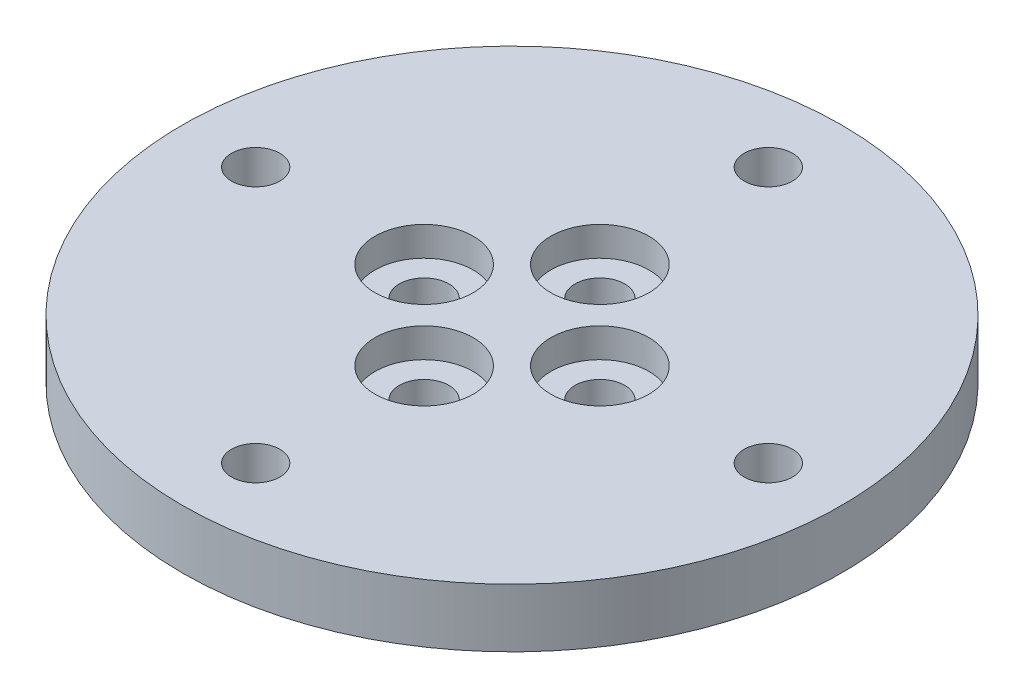
ISO-10303-21;
HEADER;
FILE_DESCRIPTION(('STEP AP214'),'2;1');
FILE_NAME('part.step','',(''),(''),'','','');
FILE_SCHEMA(('AUTOMOTIVE_DESIGN { 1 0 10303 214 1 1 1 1 }'));
ENDSEC;
DATA;
#1=APPLICATION_CONTEXT('core data for automotive mechanical design processes');
#2=APPLICATION_PROTOCOL_DEFINITION('international standard','automotive_design',2000,#1);
#3=PRODUCT_CONTEXT('',#1,'mechanical');
#4=PRODUCT('Part','Part','',(#3));
#5=PRODUCT_RELATED_PRODUCT_CATEGORY('part','',(#4));
#6=PRODUCT_DEFINITION_FORMATION('','',#4);
#7=PRODUCT_DEFINITION_CONTEXT('part definition',#1,'design');
#8=PRODUCT_DEFINITION('design','',#6,#7);
#9=PRODUCT_DEFINITION_SHAPE('','',#8);
#10=(LENGTH_UNIT() NAMED_UNIT(*) SI_UNIT(.MILLI.,.METRE.));
#11=(NAMED_UNIT(*) PLANE_ANGLE_UNIT() SI_UNIT($,.RADIAN.));
#12=(NAMED_UNIT(*) SI_UNIT($,.STERADIAN.) SOLID_ANGLE_UNIT());
#13=UNCERTAINTY_MEASURE_WITH_UNIT(LENGTH_MEASURE(1.E-05),#10,'distance_accuracy_value','');
#14=(GEOMETRIC_REPRESENTATION_CONTEXT(3) GLOBAL_UNCERTAINTY_ASSIGNED_CONTEXT((#13)) GLOBAL_UNIT_ASSIGNED_CONTEXT((#10,
#11,#12)) REPRESENTATION_CONTEXT('',''));
#15=CARTESIAN_POINT('',(0.,0.,0.));
#16=DIRECTION('',(0.,0.,1.));
#17=DIRECTION('',(1.,0.,0.));
#18=AXIS2_PLACEMENT_3D('',#15,#16,#17);
#19=CARTESIAN_POINT('',(0.,4.,0.));
#20=DIRECTION('',(0.,-1.,0.));
#21=DIRECTION('',(0.,0.,-1.));
#22=AXIS2_PLACEMENT_3D('',#19,#20,#21);
#23=CYLINDRICAL_SURFACE('',#22,22.5);
#24=CARTESIAN_POINT('',(0.,4.,0.));
#25=DIRECTION('',(0.,1.,0.));
#26=DIRECTION('',(0.,0.,1.));
#27=AXIS2_PLACEMENT_3D('',#24,#25,#26);
#28=CIRCLE('',#27,22.5);
#29=CARTESIAN_POINT('',(0.,4.,22.5));
#30=VERTEX_POINT('',#29);
#31=EDGE_CURVE('E10',#30,#30,#28,.T.);
#32=ORIENTED_EDGE('',*,*,#31,.F.);
#33=EDGE_LOOP('',(#32));
#34=FACE_BOUND('',#33,.T.);
#35=CARTESIAN_POINT('',(0.,0.,0.));
#36=DIRECTION('',(0.,1.,0.));
#37=DIRECTION('',(0.,0.,1.));
#38=AXIS2_PLACEMENT_3D('',#35,#36,#37);
#39=CIRCLE('',#38,22.5);
#40=CARTESIAN_POINT('',(0.,0.,22.5));
#41=VERTEX_POINT('',#40);
#42=EDGE_CURVE('E40',#41,#41,#39,.T.);
#43=ORIENTED_EDGE('',*,*,#42,.T.);
#44=EDGE_LOOP('',(#43));
#45=FACE_BOUND('',#44,.T.);
#46=ADVANCED_FACE('F37',(#34,#45),#23,.T.);
#47=CARTESIAN_POINT('',(0.,4.,0.));
#48=DIRECTION('',(0.,1.,0.));
#49=DIRECTION('',(0.,0.,1.));
#50=AXIS2_PLACEMENT_3D('',#47,#48,#49);
#51=PLANE('',#50);
#52=CARTESIAN_POINT('',(-17.5,4.,0.));
#53=DIRECTION('',(0.,1.,0.));
#54=DIRECTION('',(0.,0.,1.));
#55=AXIS2_PLACEMENT_3D('',#52,#53,#54);
#56=CIRCLE('',#55,1.64999999999999);
#57=CARTESIAN_POINT('',(-17.5,4.,1.64999999999999));
#58=VERTEX_POINT('',#57);
#59=EDGE_CURVE('E117',#58,#58,#56,.T.);
#60=ORIENTED_EDGE('',*,*,#59,.F.);
#61=EDGE_LOOP('',(#60));
#62=FACE_BOUND('',#61,.T.);
#63=CARTESIAN_POINT('',(0.,4.,17.5));
#64=DIRECTION('',(0.,1.,0.));
#65=DIRECTION('',(0.,0.,1.));
#66=AXIS2_PLACEMENT_3D('',#63,#64,#65);
#67=CIRCLE('',#66,1.64999999999999);
#68=CARTESIAN_POINT('',(0.,4.,19.15));
#69=VERTEX_POINT('',#68);
#70=EDGE_CURVE('E111',#69,#69,#67,.T.);
#71=ORIENTED_EDGE('',*,*,#70,.F.);
#72=EDGE_LOOP('',(#71));
#73=FACE_BOUND('',#72,.T.);
#74=CARTESIAN_POINT('',(17.5,4.,0.));
#75=DIRECTION('',(0.,1.,0.));
#76=DIRECTION('',(0.,0.,1.));
#77=AXIS2_PLACEMENT_3D('',#74,#75,#76);
#78=CIRCLE('',#77,1.64999999999999);
#79=CARTESIAN_POINT('',(17.5,4.,1.64999999999999));
#80=VERTEX_POINT('',#79);
#81=EDGE_CURVE('E105',#80,#80,#78,.T.);
#82=ORIENTED_EDGE('',*,*,#81,.F.);
#83=EDGE_LOOP('',(#82));
#84=FACE_BOUND('',#83,.T.);
#85=CARTESIAN_POINT('',(0.,4.,-17.5));
#86=DIRECTION('',(0.,1.,0.));
#87=DIRECTION('',(0.,0.,1.));
#88=AXIS2_PLACEMENT_3D('',#85,#86,#87);
#89=CIRCLE('',#88,1.64999999999999);
#90=CARTESIAN_POINT('',(0.,4.,-15.85));
#91=VERTEX_POINT('',#90);
#92=EDGE_CURVE('E99',#91,#91,#89,.T.);
#93=ORIENTED_EDGE('',*,*,#92,.F.);
#94=EDGE_LOOP('',(#93));
#95=FACE_BOUND('',#94,.T.);
#96=CARTESIAN_POINT('',(0.,4.,-6.));
#97=DIRECTION('',(0.,1.,0.));
#98=DIRECTION('',(0.,0.,1.));
#99=AXIS2_PLACEMENT_3D('',#96,#97,#98);
#100=CIRCLE('',#99,3.35);
#101=CARTESIAN_POINT('',(0.,4.,-2.65));
#102=VERTEX_POINT('',#101);
#103=EDGE_CURVE('E93',#102,#102,#100,.T.);
#104=ORIENTED_EDGE('',*,*,#103,.F.);
#105=EDGE_LOOP('',(#104));
#106=FACE_BOUND('',#105,.T.);
#107=CARTESIAN_POINT('',(-6.,4.,0.));
#108=DIRECTION('',(0.,1.,0.));
#109=DIRECTION('',(0.,0.,1.));
#110=AXIS2_PLACEMENT_3D('',#107,#108,#109);
#111=CIRCLE('',#110,3.35);
#112=CARTESIAN_POINT('',(-6.,4.,3.35));
#113=VERTEX_POINT('',#112);
#114=EDGE_CURVE('E81',#113,#113,#111,.T.);
#115=ORIENTED_EDGE('',*,*,#114,.F.);
#116=EDGE_LOOP('',(#115));
#117=FACE_BOUND('',#116,.T.);
#118=CARTESIAN_POINT('',(0.,4.,6.));
#119=DIRECTION('',(0.,1.,0.));
#120=DIRECTION('',(0.,0.,1.));
#121=AXIS2_PLACEMENT_3D('',#118,#119,#120);
#122=CIRCLE('',#121,3.35);
#123=CARTESIAN_POINT('',(0.,4.,9.35));
#124=VERTEX_POINT('',#123);
#125=EDGE_CURVE('E69',#124,#124,#122,.T.);
#126=ORIENTED_EDGE('',*,*,#125,.F.);
#127=EDGE_LOOP('',(#126));
#128=FACE_BOUND('',#127,.T.);
#129=CARTESIAN_POINT('',(6.,4.,0.));
#130=DIRECTION('',(0.,1.,0.));
#131=DIRECTION('',(0.,0.,1.));
#132=AXIS2_PLACEMENT_3D('',#129,#130,#131);
#133=CIRCLE('',#132,3.35);
#134=CARTESIAN_POINT('',(6.,4.,3.35));
#135=VERTEX_POINT('',#134);
#136=EDGE_CURVE('E57',#135,#135,#133,.T.);
#137=ORIENTED_EDGE('',*,*,#136,.F.);
#138=EDGE_LOOP('',(#137));
#139=FACE_BOUND('',#138,.T.);
#140=ORIENTED_EDGE('',*,*,#31,.T.);
#141=EDGE_LOOP('',(#140));
#142=FACE_BOUND('',#141,.T.);
#143=ADVANCED_FACE('F123',(#62,#73,#84,#95,#106,#117,#128,#139,#142),#51,.T.);
#144=CARTESIAN_POINT('',(0.,0.,0.));
#145=DIRECTION('',(0.,1.,0.));
#146=DIRECTION('',(0.,0.,1.));
#147=AXIS2_PLACEMENT_3D('',#144,#145,#146);
#148=PLANE('',#147);
#149=CARTESIAN_POINT('',(-17.5,0.,0.));
#150=DIRECTION('',(0.,1.,0.));
#151=DIRECTION('',(0.,0.,1.));
#152=AXIS2_PLACEMENT_3D('',#149,#150,#151);
#153=CIRCLE('',#152,1.64999999999999);
#154=CARTESIAN_POINT('',(-17.5,0.,1.64999999999999));
#155=VERTEX_POINT('',#154);
#156=EDGE_CURVE('E114',#155,#155,#153,.T.);
#157=ORIENTED_EDGE('',*,*,#156,.T.);
#158=EDGE_LOOP('',(#157));
#159=FACE_BOUND('',#158,.T.);
#160=CARTESIAN_POINT('',(0.,0.,17.5));
#161=DIRECTION('',(0.,1.,0.));
#162=DIRECTION('',(0.,0.,1.));
#163=AXIS2_PLACEMENT_3D('',#160,#161,#162);
#164=CIRCLE('',#163,1.64999999999999);
#165=CARTESIAN_POINT('',(0.,0.,19.15));
#166=VERTEX_POINT('',#165);
#167=EDGE_CURVE('E108',#166,#166,#164,.T.);
#168=ORIENTED_EDGE('',*,*,#167,.T.);
#169=EDGE_LOOP('',(#168));
#170=FACE_BOUND('',#169,.T.);
#171=CARTESIAN_POINT('',(17.5,0.,0.));
#172=DIRECTION('',(0.,1.,0.));
#173=DIRECTION('',(0.,0.,1.));
#174=AXIS2_PLACEMENT_3D('',#171,#172,#173);
#175=CIRCLE('',#174,1.64999999999999);
#176=CARTESIAN_POINT('',(17.5,0.,1.64999999999999));
#177=VERTEX_POINT('',#176);
#178=EDGE_CURVE('E102',#177,#177,#175,.T.);
#179=ORIENTED_EDGE('',*,*,#178,.T.);
#180=EDGE_LOOP('',(#179));
#181=FACE_BOUND('',#180,.T.);
#182=CARTESIAN_POINT('',(0.,0.,-17.5));
#183=DIRECTION('',(0.,1.,0.));
#184=DIRECTION('',(0.,0.,1.));
#185=AXIS2_PLACEMENT_3D('',#182,#183,#184);
#186=CIRCLE('',#185,1.64999999999999);
#187=CARTESIAN_POINT('',(0.,0.,-15.85));
#188=VERTEX_POINT('',#187);
#189=EDGE_CURVE('E96',#188,#188,#186,.T.);
#190=ORIENTED_EDGE('',*,*,#189,.T.);
#191=EDGE_LOOP('',(#190));
#192=FACE_BOUND('',#191,.T.);
#193=CARTESIAN_POINT('',(0.,0.,-6.));
#194=DIRECTION('',(0.,1.,0.));
#195=DIRECTION('',(0.,0.,1.));
#196=AXIS2_PLACEMENT_3D('',#193,#194,#195);
#197=CIRCLE('',#196,1.7);
#198=CARTESIAN_POINT('',(0.,0.,-4.3));
#199=VERTEX_POINT('',#198);
#200=EDGE_CURVE('E84',#199,#199,#197,.T.);
#201=ORIENTED_EDGE('',*,*,#200,.T.);
#202=EDGE_LOOP('',(#201));
#203=FACE_BOUND('',#202,.T.);
#204=CARTESIAN_POINT('',(-6.,0.,0.));
#205=DIRECTION('',(0.,1.,0.));
#206=DIRECTION('',(0.,0.,1.));
#207=AXIS2_PLACEMENT_3D('',#204,#205,#206);
#208=CIRCLE('',#207,1.7);
#209=CARTESIAN_POINT('',(-6.,0.,1.7));
#210=VERTEX_POINT('',#209);
#211=EDGE_CURVE('E72',#210,#210,#208,.T.);
#212=ORIENTED_EDGE('',*,*,#211,.T.);
#213=EDGE_LOOP('',(#212));
#214=FACE_BOUND('',#213,.T.);
#215=CARTESIAN_POINT('',(0.,0.,6.));
#216=DIRECTION('',(0.,1.,0.));
#217=DIRECTION('',(0.,0.,1.));
#218=AXIS2_PLACEMENT_3D('',#215,#216,#217);
#219=CIRCLE('',#218,1.7);
#220=CARTESIAN_POINT('',(0.,0.,7.7));
#221=VERTEX_POINT('',#220);
#222=EDGE_CURVE('E60',#221,#221,#219,.T.);
#223=ORIENTED_EDGE('',*,*,#222,.T.);
#224=EDGE_LOOP('',(#223));
#225=FACE_BOUND('',#224,.T.);
#226=CARTESIAN_POINT('',(6.,0.,0.));
#227=DIRECTION('',(0.,1.,0.));
#228=DIRECTION('',(0.,0.,1.));
#229=AXIS2_PLACEMENT_3D('',#226,#227,#228);
#230=CIRCLE('',#229,1.7);
#231=CARTESIAN_POINT('',(6.,0.,1.7));
#232=VERTEX_POINT('',#231);
#233=EDGE_CURVE('E47',#232,#232,#230,.T.);
#234=ORIENTED_EDGE('',*,*,#233,.T.);
#235=EDGE_LOOP('',(#234));
#236=FACE_BOUND('',#235,.T.);
#237=ORIENTED_EDGE('',*,*,#42,.F.);
#238=EDGE_LOOP('',(#237));
#239=FACE_BOUND('',#238,.T.);
#240=ADVANCED_FACE('F126',(#159,#170,#181,#192,#203,#214,#225,#236,#239),#148,.F.);
#241=CARTESIAN_POINT('',(6.,4.,0.));
#242=DIRECTION('',(0.,1.,0.));
#243=DIRECTION('',(0.,0.,1.));
#244=AXIS2_PLACEMENT_3D('',#241,#242,#243);
#245=CYLINDRICAL_SURFACE('',#244,1.7);
#246=ORIENTED_EDGE('',*,*,#233,.F.);
#247=EDGE_LOOP('',(#246));
#248=FACE_BOUND('',#247,.T.);
#249=CARTESIAN_POINT('',(6.,2.,0.));
#250=DIRECTION('',(0.,1.,0.));
#251=DIRECTION('',(0.,0.,1.));
#252=AXIS2_PLACEMENT_3D('',#249,#250,#251);
#253=CIRCLE('',#252,1.7);
#254=CARTESIAN_POINT('',(6.,2.,1.7));
#255=VERTEX_POINT('',#254);
#256=EDGE_CURVE('E51',#255,#255,#253,.T.);
#257=ORIENTED_EDGE('',*,*,#256,.T.);
#258=EDGE_LOOP('',(#257));
#259=FACE_BOUND('',#258,.T.);
#260=ADVANCED_FACE('F155',(#248,#259),#245,.F.);
#261=CARTESIAN_POINT('',(7.7,2.,0.));
#262=DIRECTION('',(0.,-1.,0.));
#263=DIRECTION('',(0.,0.,-1.));
#264=AXIS2_PLACEMENT_3D('',#261,#262,#263);
#265=PLANE('',#264);
#266=ORIENTED_EDGE('',*,*,#256,.F.);
#267=EDGE_LOOP('',(#266));
#268=FACE_BOUND('',#267,.T.);
#269=CARTESIAN_POINT('',(6.,2.,0.));
#270=DIRECTION('',(0.,1.,0.));
#271=DIRECTION('',(0.,0.,1.));
#272=AXIS2_PLACEMENT_3D('',#269,#270,#271);
#273=CIRCLE('',#272,3.35);
#274=CARTESIAN_POINT('',(6.,2.,3.35));
#275=VERTEX_POINT('',#274);
#276=EDGE_CURVE('E54',#275,#275,#273,.T.);
#277=ORIENTED_EDGE('',*,*,#276,.T.);
#278=EDGE_LOOP('',(#277));
#279=FACE_BOUND('',#278,.T.);
#280=ADVANCED_FACE('F145',(#268,#279),#265,.F.);
#281=CARTESIAN_POINT('',(6.,4.,0.));
#282=DIRECTION('',(0.,1.,0.));
#283=DIRECTION('',(0.,0.,1.));
#284=AXIS2_PLACEMENT_3D('',#281,#282,#283);
#285=CYLINDRICAL_SURFACE('',#284,3.35);
#286=ORIENTED_EDGE('',*,*,#276,.F.);
#287=EDGE_LOOP('',(#286));
#288=FACE_BOUND('',#287,.T.);
#289=ORIENTED_EDGE('',*,*,#136,.T.);
#290=EDGE_LOOP('',(#289));
#291=FACE_BOUND('',#290,.T.);
#292=ADVANCED_FACE('F142',(#288,#291),#285,.F.);
#293=CARTESIAN_POINT('',(0.,4.,6.));
#294=DIRECTION('',(0.,1.,0.));
#295=DIRECTION('',(0.,0.,1.));
#296=AXIS2_PLACEMENT_3D('',#293,#294,#295);
#297=CYLINDRICAL_SURFACE('',#296,1.7);
#298=ORIENTED_EDGE('',*,*,#222,.F.);
#299=EDGE_LOOP('',(#298));
#300=FACE_BOUND('',#299,.T.);
#301=CARTESIAN_POINT('',(0.,2.,6.));
#302=DIRECTION('',(0.,1.,0.));
#303=DIRECTION('',(0.,0.,1.));
#304=AXIS2_PLACEMENT_3D('',#301,#302,#303);
#305=CIRCLE('',#304,1.7);
#306=CARTESIAN_POINT('',(0.,2.,7.7));
#307=VERTEX_POINT('',#306);
#308=EDGE_CURVE('E63',#307,#307,#305,.T.);
#309=ORIENTED_EDGE('',*,*,#308,.T.);
#310=EDGE_LOOP('',(#309));
#311=FACE_BOUND('',#310,.T.);
#312=ADVANCED_FACE('F144',(#300,#311),#297,.F.);
#313=CARTESIAN_POINT('',(1.7,2.,6.));
#314=DIRECTION('',(0.,-1.,0.));
#315=DIRECTION('',(0.,0.,-1.));
#316=AXIS2_PLACEMENT_3D('',#313,#314,#315);
#317=PLANE('',#316);
#318=ORIENTED_EDGE('',*,*,#308,.F.);
#319=EDGE_LOOP('',(#318));
#320=FACE_BOUND('',#319,.T.);
#321=CARTESIAN_POINT('',(0.,2.,6.));
#322=DIRECTION('',(0.,1.,0.));
#323=DIRECTION('',(0.,0.,1.));
#324=AXIS2_PLACEMENT_3D('',#321,#322,#323);
#325=CIRCLE('',#324,3.35);
#326=CARTESIAN_POINT('',(0.,2.,9.35));
#327=VERTEX_POINT('',#326);
#328=EDGE_CURVE('E66',#327,#327,#325,.T.);
#329=ORIENTED_EDGE('',*,*,#328,.T.);
#330=EDGE_LOOP('',(#329));
#331=FACE_BOUND('',#330,.T.);
#332=ADVANCED_FACE('F152',(#320,#331),#317,.F.);
#333=CARTESIAN_POINT('',(0.,4.,6.));
#334=DIRECTION('',(0.,1.,0.));
#335=DIRECTION('',(0.,0.,1.));
#336=AXIS2_PLACEMENT_3D('',#333,#334,#335);
#337=CYLINDRICAL_SURFACE('',#336,3.35);
#338=ORIENTED_EDGE('',*,*,#328,.F.);
#339=EDGE_LOOP('',(#338));
#340=FACE_BOUND('',#339,.T.);
#341=ORIENTED_EDGE('',*,*,#125,.T.);
#342=EDGE_LOOP('',(#341));
#343=FACE_BOUND('',#342,.T.);
#344=ADVANCED_FACE('F196',(#340,#343),#337,.F.);
#345=CARTESIAN_POINT('',(-6.,4.,0.));
#346=DIRECTION('',(0.,1.,0.));
#347=DIRECTION('',(0.,0.,1.));
#348=AXIS2_PLACEMENT_3D('',#345,#346,#347);
#349=CYLINDRICAL_SURFACE('',#348,1.7);
#350=ORIENTED_EDGE('',*,*,#211,.F.);
#351=EDGE_LOOP('',(#350));
#352=FACE_BOUND('',#351,.T.);
#353=CARTESIAN_POINT('',(-6.,2.,0.));
#354=DIRECTION('',(0.,1.,0.));
#355=DIRECTION('',(0.,0.,1.));
#356=AXIS2_PLACEMENT_3D('',#353,#354,#355);
#357=CIRCLE('',#356,1.7);
#358=CARTESIAN_POINT('',(-6.,2.,1.7));
#359=VERTEX_POINT('',#358);
#360=EDGE_CURVE('E75',#359,#359,#357,.T.);
#361=ORIENTED_EDGE('',*,*,#360,.T.);
#362=EDGE_LOOP('',(#361));
#363=FACE_BOUND('',#362,.T.);
#364=ADVANCED_FACE('F202',(#352,#363),#349,.F.);
#365=CARTESIAN_POINT('',(-4.3,2.,0.));
#366=DIRECTION('',(0.,-1.,0.));
#367=DIRECTION('',(0.,0.,-1.));
#368=AXIS2_PLACEMENT_3D('',#365,#366,#367);
#369=PLANE('',#368);
#370=ORIENTED_EDGE('',*,*,#360,.F.);
#371=EDGE_LOOP('',(#370));
#372=FACE_BOUND('',#371,.T.);
#373=CARTESIAN_POINT('',(-6.,2.,0.));
#374=DIRECTION('',(0.,1.,0.));
#375=DIRECTION('',(0.,0.,1.));
#376=AXIS2_PLACEMENT_3D('',#373,#374,#375);
#377=CIRCLE('',#376,3.35);
#378=CARTESIAN_POINT('',(-6.,2.,3.35));
#379=VERTEX_POINT('',#378);
#380=EDGE_CURVE('E78',#379,#379,#377,.T.);
#381=ORIENTED_EDGE('',*,*,#380,.T.);
#382=EDGE_LOOP('',(#381));
#383=FACE_BOUND('',#382,.T.);
#384=ADVANCED_FACE('F207',(#372,#383),#369,.F.);
#385=CARTESIAN_POINT('',(-6.,4.,0.));
#386=DIRECTION('',(0.,1.,0.));
#387=DIRECTION('',(0.,0.,1.));
#388=AXIS2_PLACEMENT_3D('',#385,#386,#387);
#389=CYLINDRICAL_SURFACE('',#388,3.35);
#390=ORIENTED_EDGE('',*,*,#380,.F.);
#391=EDGE_LOOP('',(#390));
#392=FACE_BOUND('',#391,.T.);
#393=ORIENTED_EDGE('',*,*,#114,.T.);
#394=EDGE_LOOP('',(#393));
#395=FACE_BOUND('',#394,.T.);
#396=ADVANCED_FACE('F213',(#392,#395),#389,.F.);
#397=CARTESIAN_POINT('',(0.,4.,-6.));
#398=DIRECTION('',(0.,1.,0.));
#399=DIRECTION('',(0.,0.,1.));
#400=AXIS2_PLACEMENT_3D('',#397,#398,#399);
#401=CYLINDRICAL_SURFACE('',#400,1.7);
#402=ORIENTED_EDGE('',*,*,#200,.F.);
#403=EDGE_LOOP('',(#402));
#404=FACE_BOUND('',#403,.T.);
#405=CARTESIAN_POINT('',(0.,2.,-6.));
#406=DIRECTION('',(0.,1.,0.));
#407=DIRECTION('',(0.,0.,1.));
#408=AXIS2_PLACEMENT_3D('',#405,#406,#407);
#409=CIRCLE('',#408,1.7);
#410=CARTESIAN_POINT('',(0.,2.,-4.3));
#411=VERTEX_POINT('',#410);
#412=EDGE_CURVE('E87',#411,#411,#409,.T.);
#413=ORIENTED_EDGE('',*,*,#412,.T.);
#414=EDGE_LOOP('',(#413));
#415=FACE_BOUND('',#414,.T.);
#416=ADVANCED_FACE('F217',(#404,#415),#401,.F.);
#417=CARTESIAN_POINT('',(1.7,2.,-6.));
#418=DIRECTION('',(0.,-1.,0.));
#419=DIRECTION('',(0.,0.,-1.));
#420=AXIS2_PLACEMENT_3D('',#417,#418,#419);
#421=PLANE('',#420);
#422=ORIENTED_EDGE('',*,*,#412,.F.);
#423=EDGE_LOOP('',(#422));
#424=FACE_BOUND('',#423,.T.);
#425=CARTESIAN_POINT('',(0.,2.,-6.));
#426=DIRECTION('',(0.,1.,0.));
#427=DIRECTION('',(0.,0.,1.));
#428=AXIS2_PLACEMENT_3D('',#425,#426,#427);
#429=CIRCLE('',#428,3.35);
#430=CARTESIAN_POINT('',(0.,2.,-2.65));
#431=VERTEX_POINT('',#430);
#432=EDGE_CURVE('E90',#431,#431,#429,.T.);
#433=ORIENTED_EDGE('',*,*,#432,.T.);
#434=EDGE_LOOP('',(#433));
#435=FACE_BOUND('',#434,.T.);
#436=ADVANCED_FACE('F221',(#424,#435),#421,.F.);
#437=CARTESIAN_POINT('',(0.,4.,-6.));
#438=DIRECTION('',(0.,1.,0.));
#439=DIRECTION('',(0.,0.,1.));
#440=AXIS2_PLACEMENT_3D('',#437,#438,#439);
#441=CYLINDRICAL_SURFACE('',#440,3.35);
#442=ORIENTED_EDGE('',*,*,#432,.F.);
#443=EDGE_LOOP('',(#442));
#444=FACE_BOUND('',#443,.T.);
#445=ORIENTED_EDGE('',*,*,#103,.T.);
#446=EDGE_LOOP('',(#445));
#447=FACE_BOUND('',#446,.T.);
#448=ADVANCED_FACE('F225',(#444,#447),#441,.F.);
#449=CARTESIAN_POINT('',(0.,4.,-17.5));
#450=DIRECTION('',(0.,1.,0.));
#451=DIRECTION('',(0.,0.,1.));
#452=AXIS2_PLACEMENT_3D('',#449,#450,#451);
#453=CYLINDRICAL_SURFACE('',#452,1.64999999999999);
#454=ORIENTED_EDGE('',*,*,#189,.F.);
#455=EDGE_LOOP('',(#454));
#456=FACE_BOUND('',#455,.T.);
#457=ORIENTED_EDGE('',*,*,#92,.T.);
#458=EDGE_LOOP('',(#457));
#459=FACE_BOUND('',#458,.T.);
#460=ADVANCED_FACE('F229',(#456,#459),#453,.F.);
#461=CARTESIAN_POINT('',(17.5,4.,0.));
#462=DIRECTION('',(0.,1.,0.));
#463=DIRECTION('',(0.,0.,1.));
#464=AXIS2_PLACEMENT_3D('',#461,#462,#463);
#465=CYLINDRICAL_SURFACE('',#464,1.64999999999999);
#466=ORIENTED_EDGE('',*,*,#178,.F.);
#467=EDGE_LOOP('',(#466));
#468=FACE_BOUND('',#467,.T.);
#469=ORIENTED_EDGE('',*,*,#81,.T.);
#470=EDGE_LOOP('',(#469));
#471=FACE_BOUND('',#470,.T.);
#472=ADVANCED_FACE('F233',(#468,#471),#465,.F.);
#473=CARTESIAN_POINT('',(0.,4.,17.5));
#474=DIRECTION('',(0.,1.,0.));
#475=DIRECTION('',(0.,0.,1.));
#476=AXIS2_PLACEMENT_3D('',#473,#474,#475);
#477=CYLINDRICAL_SURFACE('',#476,1.64999999999999);
#478=ORIENTED_EDGE('',*,*,#167,.F.);
#479=EDGE_LOOP('',(#478));
#480=FACE_BOUND('',#479,.T.);
#481=ORIENTED_EDGE('',*,*,#70,.T.);
#482=EDGE_LOOP('',(#481));
#483=FACE_BOUND('',#482,.T.);
#484=ADVANCED_FACE('F237',(#480,#483),#477,.F.);
#485=CARTESIAN_POINT('',(-17.5,4.,0.));
#486=DIRECTION('',(0.,1.,0.));
#487=DIRECTION('',(0.,0.,1.));
#488=AXIS2_PLACEMENT_3D('',#485,#486,#487);
#489=CYLINDRICAL_SURFACE('',#488,1.64999999999999);
#490=ORIENTED_EDGE('',*,*,#156,.F.);
#491=EDGE_LOOP('',(#490));
#492=FACE_BOUND('',#491,.T.);
#493=ORIENTED_EDGE('',*,*,#59,.T.);
#494=EDGE_LOOP('',(#493));
#495=FACE_BOUND('',#494,.T.);
#496=ADVANCED_FACE('F121',(#492,#495),#489,.F.);
#497=CLOSED_SHELL('',(#46,#143,#240,#260,#280,#292,#312,#332,#344,#364,#384,#396,#416,#436,#448,
#460,#472,#484,#496));
#498=MANIFOLD_SOLID_BREP('B2',#497);
#499=ADVANCED_BREP_SHAPE_REPRESENTATION('',(#18,#498),#14);
#500=SHAPE_DEFINITION_REPRESENTATION(#9,#499);
ENDSEC;
END-ISO-10303-21;
